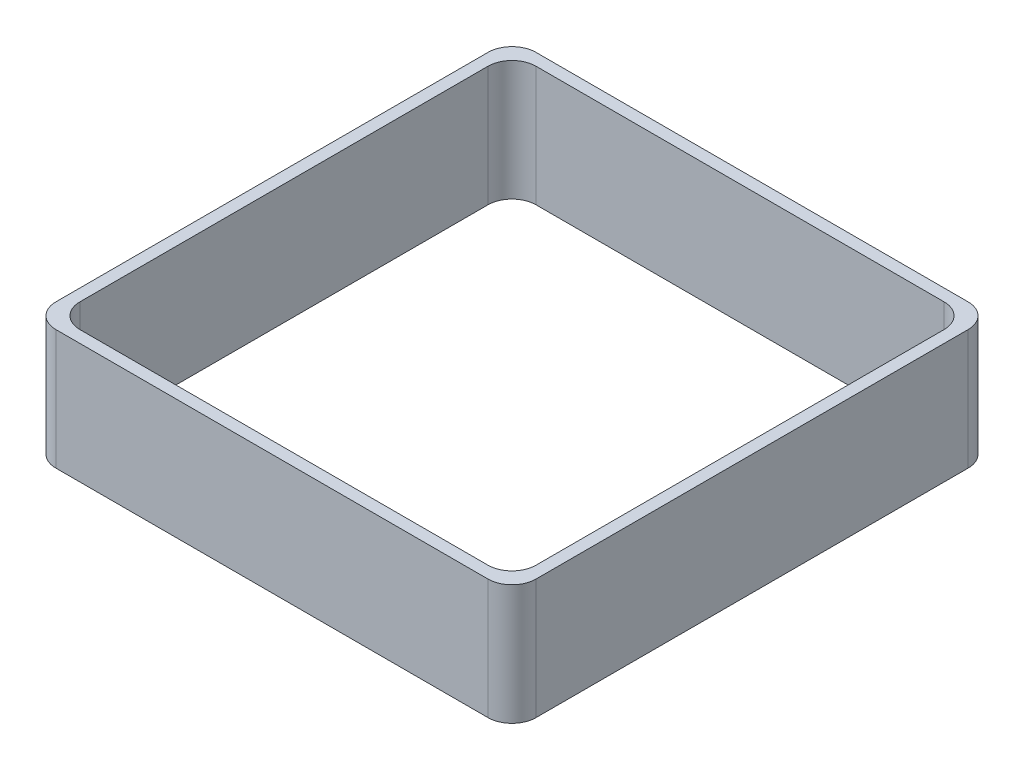
ISO-10303-21;
HEADER;
FILE_DESCRIPTION(('STEP AP214'),'2;1');
FILE_NAME('part.step','',(''),(''),'','','');
FILE_SCHEMA(('AUTOMOTIVE_DESIGN { 1 0 10303 214 1 1 1 1 }'));
ENDSEC;
DATA;
#1=APPLICATION_CONTEXT('core data for automotive mechanical design processes');
#2=APPLICATION_PROTOCOL_DEFINITION('international standard','automotive_design',2000,#1);
#3=PRODUCT_CONTEXT('',#1,'mechanical');
#4=PRODUCT('Part','Part','',(#3));
#5=PRODUCT_RELATED_PRODUCT_CATEGORY('part','',(#4));
#6=PRODUCT_DEFINITION_FORMATION('','',#4);
#7=PRODUCT_DEFINITION_CONTEXT('part definition',#1,'design');
#8=PRODUCT_DEFINITION('design','',#6,#7);
#9=PRODUCT_DEFINITION_SHAPE('','',#8);
#10=(LENGTH_UNIT() NAMED_UNIT(*) SI_UNIT(.MILLI.,.METRE.));
#11=(NAMED_UNIT(*) PLANE_ANGLE_UNIT() SI_UNIT($,.RADIAN.));
#12=(NAMED_UNIT(*) SI_UNIT($,.STERADIAN.) SOLID_ANGLE_UNIT());
#13=UNCERTAINTY_MEASURE_WITH_UNIT(LENGTH_MEASURE(1.E-05),#10,'distance_accuracy_value','');
#14=(GEOMETRIC_REPRESENTATION_CONTEXT(3) GLOBAL_UNCERTAINTY_ASSIGNED_CONTEXT((#13)) GLOBAL_UNIT_ASSIGNED_CONTEXT((#10,
#11,#12)) REPRESENTATION_CONTEXT('',''));
#15=CARTESIAN_POINT('',(0.,0.,0.));
#16=DIRECTION('',(0.,0.,1.));
#17=DIRECTION('',(1.,0.,0.));
#18=AXIS2_PLACEMENT_3D('',#15,#16,#17);
#19=CARTESIAN_POINT('',(0.,50.,0.));
#20=DIRECTION('',(0.,-1.,0.));
#21=DIRECTION('',(0.,0.,-1.));
#22=AXIS2_PLACEMENT_3D('',#19,#20,#21);
#23=PLANE('',#22);
#24=DIRECTION('',(-1.,0.,0.));
#25=VECTOR('',#24,1.);
#26=CARTESIAN_POINT('',(100.,50.,-100.));
#27=LINE('',#26,#25);
#28=CARTESIAN_POINT('',(90.,50.,-100.));
#29=VERTEX_POINT('',#28);
#30=CARTESIAN_POINT('',(-90.,50.,-100.));
#31=VERTEX_POINT('',#30);
#32=EDGE_CURVE('E183',#29,#31,#27,.T.);
#33=ORIENTED_EDGE('',*,*,#32,.T.);
#34=CARTESIAN_POINT('',(-90.,50.,-90.));
#35=DIRECTION('',(0.,-1.,0.));
#36=DIRECTION('',(0.,0.,-1.));
#37=AXIS2_PLACEMENT_3D('',#34,#35,#36);
#38=CIRCLE('',#37,10.);
#39=CARTESIAN_POINT('',(-100.,50.,-90.));
#40=VERTEX_POINT('',#39);
#41=EDGE_CURVE('E204',#31,#40,#38,.F.);
#42=ORIENTED_EDGE('',*,*,#41,.T.);
#43=DIRECTION('',(0.,0.,1.));
#44=VECTOR('',#43,1.);
#45=CARTESIAN_POINT('',(-100.,50.,-100.));
#46=LINE('',#45,#44);
#47=CARTESIAN_POINT('',(-100.,50.,90.));
#48=VERTEX_POINT('',#47);
#49=EDGE_CURVE('E166',#40,#48,#46,.T.);
#50=ORIENTED_EDGE('',*,*,#49,.T.);
#51=CARTESIAN_POINT('',(-90.,50.,90.));
#52=DIRECTION('',(0.,-1.,0.));
#53=DIRECTION('',(0.,0.,-1.));
#54=AXIS2_PLACEMENT_3D('',#51,#52,#53);
#55=CIRCLE('',#54,10.);
#56=CARTESIAN_POINT('',(-90.,50.,100.));
#57=VERTEX_POINT('',#56);
#58=EDGE_CURVE('E202',#48,#57,#55,.F.);
#59=ORIENTED_EDGE('',*,*,#58,.T.);
#60=DIRECTION('',(1.,0.,0.));
#61=VECTOR('',#60,1.);
#62=CARTESIAN_POINT('',(100.,50.,100.));
#63=LINE('',#62,#61);
#64=CARTESIAN_POINT('',(90.,50.,100.));
#65=VERTEX_POINT('',#64);
#66=EDGE_CURVE('E276',#57,#65,#63,.T.);
#67=ORIENTED_EDGE('',*,*,#66,.T.);
#68=CARTESIAN_POINT('',(90.,50.,90.));
#69=DIRECTION('',(0.,-1.,0.));
#70=DIRECTION('',(0.,0.,-1.));
#71=AXIS2_PLACEMENT_3D('',#68,#69,#70);
#72=CIRCLE('',#71,10.);
#73=CARTESIAN_POINT('',(100.,50.,90.));
#74=VERTEX_POINT('',#73);
#75=EDGE_CURVE('E200',#65,#74,#72,.F.);
#76=ORIENTED_EDGE('',*,*,#75,.T.);
#77=DIRECTION('',(0.,0.,-1.));
#78=VECTOR('',#77,1.);
#79=CARTESIAN_POINT('',(100.,50.,-100.));
#80=LINE('',#79,#78);
#81=CARTESIAN_POINT('',(100.,50.,-90.));
#82=VERTEX_POINT('',#81);
#83=EDGE_CURVE('E278',#74,#82,#80,.T.);
#84=ORIENTED_EDGE('',*,*,#83,.T.);
#85=CARTESIAN_POINT('',(90.,50.,-90.));
#86=DIRECTION('',(0.,-1.,0.));
#87=DIRECTION('',(0.,0.,-1.));
#88=AXIS2_PLACEMENT_3D('',#85,#86,#87);
#89=CIRCLE('',#88,10.);
#90=EDGE_CURVE('E198',#82,#29,#89,.F.);
#91=ORIENTED_EDGE('',*,*,#90,.T.);
#92=EDGE_LOOP('',(#33,#42,#50,#59,#67,#76,#84,#91));
#93=FACE_BOUND('',#92,.T.);
#94=DIRECTION('',(0.,0.,-1.));
#95=VECTOR('',#94,1.);
#96=CARTESIAN_POINT('',(95.,50.,-95.));
#97=LINE('',#96,#95);
#98=CARTESIAN_POINT('',(95.,50.,85.));
#99=VERTEX_POINT('',#98);
#100=CARTESIAN_POINT('',(95.,50.,-85.));
#101=VERTEX_POINT('',#100);
#102=EDGE_CURVE('E263',#99,#101,#97,.T.);
#103=ORIENTED_EDGE('',*,*,#102,.F.);
#104=CARTESIAN_POINT('',(85.,50.,85.));
#105=DIRECTION('',(0.,-1.,0.));
#106=DIRECTION('',(0.,0.,-1.));
#107=AXIS2_PLACEMENT_3D('',#104,#105,#106);
#108=CIRCLE('',#107,10.);
#109=CARTESIAN_POINT('',(85.,50.,95.));
#110=VERTEX_POINT('',#109);
#111=EDGE_CURVE('E241',#99,#110,#108,.T.);
#112=ORIENTED_EDGE('',*,*,#111,.T.);
#113=DIRECTION('',(1.,0.,0.));
#114=VECTOR('',#113,1.);
#115=CARTESIAN_POINT('',(95.,50.,95.));
#116=LINE('',#115,#114);
#117=CARTESIAN_POINT('',(-85.,50.,95.));
#118=VERTEX_POINT('',#117);
#119=EDGE_CURVE('E174',#118,#110,#116,.T.);
#120=ORIENTED_EDGE('',*,*,#119,.F.);
#121=CARTESIAN_POINT('',(-85.,50.,85.));
#122=DIRECTION('',(0.,-1.,0.));
#123=DIRECTION('',(0.,0.,-1.));
#124=AXIS2_PLACEMENT_3D('',#121,#122,#123);
#125=CIRCLE('',#124,10.);
#126=CARTESIAN_POINT('',(-95.,50.,85.));
#127=VERTEX_POINT('',#126);
#128=EDGE_CURVE('E245',#118,#127,#125,.T.);
#129=ORIENTED_EDGE('',*,*,#128,.T.);
#130=DIRECTION('',(0.,0.,1.));
#131=VECTOR('',#130,1.);
#132=CARTESIAN_POINT('',(-95.,50.,-95.));
#133=LINE('',#132,#131);
#134=CARTESIAN_POINT('',(-95.,50.,-85.));
#135=VERTEX_POINT('',#134);
#136=EDGE_CURVE('E180',#135,#127,#133,.T.);
#137=ORIENTED_EDGE('',*,*,#136,.F.);
#138=CARTESIAN_POINT('',(-85.,50.,-85.));
#139=DIRECTION('',(0.,-1.,0.));
#140=DIRECTION('',(0.,0.,-1.));
#141=AXIS2_PLACEMENT_3D('',#138,#139,#140);
#142=CIRCLE('',#141,10.);
#143=CARTESIAN_POINT('',(-85.,50.,-95.));
#144=VERTEX_POINT('',#143);
#145=EDGE_CURVE('E11',#135,#144,#142,.T.);
#146=ORIENTED_EDGE('',*,*,#145,.T.);
#147=DIRECTION('',(-1.,0.,0.));
#148=VECTOR('',#147,1.);
#149=CARTESIAN_POINT('',(95.,50.,-95.));
#150=LINE('',#149,#148);
#151=CARTESIAN_POINT('',(85.,50.,-95.));
#152=VERTEX_POINT('',#151);
#153=EDGE_CURVE('E261',#152,#144,#150,.T.);
#154=ORIENTED_EDGE('',*,*,#153,.F.);
#155=CARTESIAN_POINT('',(85.,50.,-85.));
#156=DIRECTION('',(0.,-1.,0.));
#157=DIRECTION('',(0.,0.,-1.));
#158=AXIS2_PLACEMENT_3D('',#155,#156,#157);
#159=CIRCLE('',#158,10.);
#160=EDGE_CURVE('E237',#152,#101,#159,.T.);
#161=ORIENTED_EDGE('',*,*,#160,.T.);
#162=EDGE_LOOP('',(#103,#112,#120,#129,#137,#146,#154,#161));
#163=FACE_BOUND('',#162,.T.);
#164=ADVANCED_FACE('F33',(#93,#163),#23,.F.);
#165=CARTESIAN_POINT('',(0.,0.,0.));
#166=DIRECTION('',(0.,-1.,0.));
#167=DIRECTION('',(0.,0.,-1.));
#168=AXIS2_PLACEMENT_3D('',#165,#166,#167);
#169=PLANE('',#168);
#170=DIRECTION('',(0.,0.,1.));
#171=VECTOR('',#170,1.);
#172=CARTESIAN_POINT('',(-100.,0.,-100.));
#173=LINE('',#172,#171);
#174=CARTESIAN_POINT('',(-100.,0.,-90.));
#175=VERTEX_POINT('',#174);
#176=CARTESIAN_POINT('',(-100.,0.,90.));
#177=VERTEX_POINT('',#176);
#178=EDGE_CURVE('E163',#175,#177,#173,.T.);
#179=ORIENTED_EDGE('',*,*,#178,.F.);
#180=CARTESIAN_POINT('',(-90.,0.,-90.));
#181=DIRECTION('',(0.,-1.,0.));
#182=DIRECTION('',(0.,0.,-1.));
#183=AXIS2_PLACEMENT_3D('',#180,#181,#182);
#184=CIRCLE('',#183,10.);
#185=CARTESIAN_POINT('',(-90.,0.,-100.));
#186=VERTEX_POINT('',#185);
#187=EDGE_CURVE('E146',#175,#186,#184,.T.);
#188=ORIENTED_EDGE('',*,*,#187,.T.);
#189=DIRECTION('',(-1.,0.,0.));
#190=VECTOR('',#189,1.);
#191=CARTESIAN_POINT('',(100.,0.,-100.));
#192=LINE('',#191,#190);
#193=CARTESIAN_POINT('',(90.,0.,-100.));
#194=VERTEX_POINT('',#193);
#195=EDGE_CURVE('E188',#194,#186,#192,.T.);
#196=ORIENTED_EDGE('',*,*,#195,.F.);
#197=CARTESIAN_POINT('',(90.,0.,-90.));
#198=DIRECTION('',(0.,-1.,0.));
#199=DIRECTION('',(0.,0.,-1.));
#200=AXIS2_PLACEMENT_3D('',#197,#198,#199);
#201=CIRCLE('',#200,10.);
#202=CARTESIAN_POINT('',(100.,0.,-90.));
#203=VERTEX_POINT('',#202);
#204=EDGE_CURVE('E167',#194,#203,#201,.T.);
#205=ORIENTED_EDGE('',*,*,#204,.T.);
#206=DIRECTION('',(0.,0.,-1.));
#207=VECTOR('',#206,1.);
#208=CARTESIAN_POINT('',(100.,0.,-100.));
#209=LINE('',#208,#207);
#210=CARTESIAN_POINT('',(100.,0.,90.));
#211=VERTEX_POINT('',#210);
#212=EDGE_CURVE('E177',#211,#203,#209,.T.);
#213=ORIENTED_EDGE('',*,*,#212,.F.);
#214=CARTESIAN_POINT('',(90.,0.,90.));
#215=DIRECTION('',(0.,-1.,0.));
#216=DIRECTION('',(0.,0.,-1.));
#217=AXIS2_PLACEMENT_3D('',#214,#215,#216);
#218=CIRCLE('',#217,10.);
#219=CARTESIAN_POINT('',(90.,0.,100.));
#220=VERTEX_POINT('',#219);
#221=EDGE_CURVE('E192',#211,#220,#218,.T.);
#222=ORIENTED_EDGE('',*,*,#221,.T.);
#223=DIRECTION('',(1.,0.,0.));
#224=VECTOR('',#223,1.);
#225=CARTESIAN_POINT('',(100.,0.,100.));
#226=LINE('',#225,#224);
#227=CARTESIAN_POINT('',(-90.,0.,100.));
#228=VERTEX_POINT('',#227);
#229=EDGE_CURVE('E173',#228,#220,#226,.T.);
#230=ORIENTED_EDGE('',*,*,#229,.F.);
#231=CARTESIAN_POINT('',(-90.,0.,90.));
#232=DIRECTION('',(0.,-1.,0.));
#233=DIRECTION('',(0.,0.,-1.));
#234=AXIS2_PLACEMENT_3D('',#231,#232,#233);
#235=CIRCLE('',#234,10.);
#236=EDGE_CURVE('E157',#228,#177,#235,.T.);
#237=ORIENTED_EDGE('',*,*,#236,.T.);
#238=EDGE_LOOP('',(#179,#188,#196,#205,#213,#222,#230,#237));
#239=FACE_BOUND('',#238,.T.);
#240=DIRECTION('',(0.,0.,1.));
#241=VECTOR('',#240,1.);
#242=CARTESIAN_POINT('',(-95.,0.,-95.));
#243=LINE('',#242,#241);
#244=CARTESIAN_POINT('',(-95.,0.,-85.));
#245=VERTEX_POINT('',#244);
#246=CARTESIAN_POINT('',(-95.,0.,85.));
#247=VERTEX_POINT('',#246);
#248=EDGE_CURVE('E249',#245,#247,#243,.T.);
#249=ORIENTED_EDGE('',*,*,#248,.T.);
#250=CARTESIAN_POINT('',(-85.,0.,85.));
#251=DIRECTION('',(0.,-1.,0.));
#252=DIRECTION('',(0.,0.,-1.));
#253=AXIS2_PLACEMENT_3D('',#250,#251,#252);
#254=CIRCLE('',#253,10.);
#255=CARTESIAN_POINT('',(-85.,0.,95.));
#256=VERTEX_POINT('',#255);
#257=EDGE_CURVE('E243',#247,#256,#254,.F.);
#258=ORIENTED_EDGE('',*,*,#257,.T.);
#259=DIRECTION('',(1.,0.,0.));
#260=VECTOR('',#259,1.);
#261=CARTESIAN_POINT('',(95.,0.,95.));
#262=LINE('',#261,#260);
#263=CARTESIAN_POINT('',(85.,0.,95.));
#264=VERTEX_POINT('',#263);
#265=EDGE_CURVE('E258',#256,#264,#262,.T.);
#266=ORIENTED_EDGE('',*,*,#265,.T.);
#267=CARTESIAN_POINT('',(85.,0.,85.));
#268=DIRECTION('',(0.,-1.,0.));
#269=DIRECTION('',(0.,0.,-1.));
#270=AXIS2_PLACEMENT_3D('',#267,#268,#269);
#271=CIRCLE('',#270,10.);
#272=CARTESIAN_POINT('',(95.,0.,85.));
#273=VERTEX_POINT('',#272);
#274=EDGE_CURVE('E239',#264,#273,#271,.F.);
#275=ORIENTED_EDGE('',*,*,#274,.T.);
#276=DIRECTION('',(0.,0.,-1.));
#277=VECTOR('',#276,1.);
#278=CARTESIAN_POINT('',(95.,0.,-95.));
#279=LINE('',#278,#277);
#280=CARTESIAN_POINT('',(95.,0.,-85.));
#281=VERTEX_POINT('',#280);
#282=EDGE_CURVE('E269',#273,#281,#279,.T.);
#283=ORIENTED_EDGE('',*,*,#282,.T.);
#284=CARTESIAN_POINT('',(85.,0.,-85.));
#285=DIRECTION('',(0.,-1.,0.));
#286=DIRECTION('',(0.,0.,-1.));
#287=AXIS2_PLACEMENT_3D('',#284,#285,#286);
#288=CIRCLE('',#287,10.);
#289=CARTESIAN_POINT('',(85.,0.,-95.));
#290=VERTEX_POINT('',#289);
#291=EDGE_CURVE('E235',#281,#290,#288,.F.);
#292=ORIENTED_EDGE('',*,*,#291,.T.);
#293=DIRECTION('',(-1.,0.,0.));
#294=VECTOR('',#293,1.);
#295=CARTESIAN_POINT('',(95.,0.,-95.));
#296=LINE('',#295,#294);
#297=CARTESIAN_POINT('',(-85.,0.,-95.));
#298=VERTEX_POINT('',#297);
#299=EDGE_CURVE('E250',#290,#298,#296,.T.);
#300=ORIENTED_EDGE('',*,*,#299,.T.);
#301=CARTESIAN_POINT('',(-85.,0.,-85.));
#302=DIRECTION('',(0.,-1.,0.));
#303=DIRECTION('',(0.,0.,-1.));
#304=AXIS2_PLACEMENT_3D('',#301,#302,#303);
#305=CIRCLE('',#304,10.);
#306=EDGE_CURVE('E41',#298,#245,#305,.F.);
#307=ORIENTED_EDGE('',*,*,#306,.T.);
#308=EDGE_LOOP('',(#249,#258,#266,#275,#283,#292,#300,#307));
#309=FACE_BOUND('',#308,.T.);
#310=ADVANCED_FACE('F170',(#239,#309),#169,.T.);
#311=CARTESIAN_POINT('',(-100.,50.,-100.));
#312=DIRECTION('',(1.,0.,0.));
#313=DIRECTION('',(0.,0.,-1.));
#314=AXIS2_PLACEMENT_3D('',#311,#312,#313);
#315=PLANE('',#314);
#316=ORIENTED_EDGE('',*,*,#49,.F.);
#317=DIRECTION('',(0.,-1.,0.));
#318=VECTOR('',#317,1.);
#319=CARTESIAN_POINT('',(-100.,50.,-90.));
#320=LINE('',#319,#318);
#321=EDGE_CURVE('E150',#40,#175,#320,.T.);
#322=ORIENTED_EDGE('',*,*,#321,.T.);
#323=ORIENTED_EDGE('',*,*,#178,.T.);
#324=DIRECTION('',(0.,-1.,0.));
#325=VECTOR('',#324,1.);
#326=CARTESIAN_POINT('',(-100.,50.,90.));
#327=LINE('',#326,#325);
#328=EDGE_CURVE('E168',#177,#48,#327,.F.);
#329=ORIENTED_EDGE('',*,*,#328,.T.);
#330=EDGE_LOOP('',(#316,#322,#323,#329));
#331=FACE_BOUND('',#330,.T.);
#332=ADVANCED_FACE('F162',(#331),#315,.F.);
#333=CARTESIAN_POINT('',(100.,50.,100.));
#334=DIRECTION('',(0.,0.,-1.));
#335=DIRECTION('',(-1.,0.,0.));
#336=AXIS2_PLACEMENT_3D('',#333,#334,#335);
#337=PLANE('',#336);
#338=ORIENTED_EDGE('',*,*,#66,.F.);
#339=DIRECTION('',(0.,-1.,0.));
#340=VECTOR('',#339,1.);
#341=CARTESIAN_POINT('',(-90.,50.,100.));
#342=LINE('',#341,#340);
#343=EDGE_CURVE('E208',#57,#228,#342,.T.);
#344=ORIENTED_EDGE('',*,*,#343,.T.);
#345=ORIENTED_EDGE('',*,*,#229,.T.);
#346=DIRECTION('',(0.,-1.,0.));
#347=VECTOR('',#346,1.);
#348=CARTESIAN_POINT('',(90.,50.,100.));
#349=LINE('',#348,#347);
#350=EDGE_CURVE('E206',#220,#65,#349,.F.);
#351=ORIENTED_EDGE('',*,*,#350,.T.);
#352=EDGE_LOOP('',(#338,#344,#345,#351));
#353=FACE_BOUND('',#352,.T.);
#354=ADVANCED_FACE('F301',(#353),#337,.F.);
#355=CARTESIAN_POINT('',(100.,50.,-100.));
#356=DIRECTION('',(-1.,0.,0.));
#357=DIRECTION('',(0.,0.,1.));
#358=AXIS2_PLACEMENT_3D('',#355,#356,#357);
#359=PLANE('',#358);
#360=ORIENTED_EDGE('',*,*,#83,.F.);
#361=DIRECTION('',(0.,-1.,0.));
#362=VECTOR('',#361,1.);
#363=CARTESIAN_POINT('',(100.,50.,90.));
#364=LINE('',#363,#362);
#365=EDGE_CURVE('E213',#74,#211,#364,.T.);
#366=ORIENTED_EDGE('',*,*,#365,.T.);
#367=ORIENTED_EDGE('',*,*,#212,.T.);
#368=DIRECTION('',(0.,-1.,0.));
#369=VECTOR('',#368,1.);
#370=CARTESIAN_POINT('',(100.,50.,-90.));
#371=LINE('',#370,#369);
#372=EDGE_CURVE('E211',#203,#82,#371,.F.);
#373=ORIENTED_EDGE('',*,*,#372,.T.);
#374=EDGE_LOOP('',(#360,#366,#367,#373));
#375=FACE_BOUND('',#374,.T.);
#376=ADVANCED_FACE('F293',(#375),#359,.F.);
#377=CARTESIAN_POINT('',(100.,50.,-100.));
#378=DIRECTION('',(0.,0.,1.));
#379=DIRECTION('',(1.,0.,0.));
#380=AXIS2_PLACEMENT_3D('',#377,#378,#379);
#381=PLANE('',#380);
#382=ORIENTED_EDGE('',*,*,#195,.T.);
#383=DIRECTION('',(0.,-1.,0.));
#384=VECTOR('',#383,1.);
#385=CARTESIAN_POINT('',(-90.,50.,-100.));
#386=LINE('',#385,#384);
#387=EDGE_CURVE('E151',#186,#31,#386,.F.);
#388=ORIENTED_EDGE('',*,*,#387,.T.);
#389=ORIENTED_EDGE('',*,*,#32,.F.);
#390=DIRECTION('',(0.,-1.,0.));
#391=VECTOR('',#390,1.);
#392=CARTESIAN_POINT('',(90.,50.,-100.));
#393=LINE('',#392,#391);
#394=EDGE_CURVE('E156',#29,#194,#393,.T.);
#395=ORIENTED_EDGE('',*,*,#394,.T.);
#396=EDGE_LOOP('',(#382,#388,#389,#395));
#397=FACE_BOUND('',#396,.T.);
#398=ADVANCED_FACE('F287',(#397),#381,.F.);
#399=CARTESIAN_POINT('',(95.,50.,-95.));
#400=DIRECTION('',(-1.,0.,0.));
#401=DIRECTION('',(0.,0.,1.));
#402=AXIS2_PLACEMENT_3D('',#399,#400,#401);
#403=PLANE('',#402);
#404=ORIENTED_EDGE('',*,*,#102,.T.);
#405=DIRECTION('',(0.,-1.,0.));
#406=VECTOR('',#405,1.);
#407=CARTESIAN_POINT('',(95.,0.,-85.));
#408=LINE('',#407,#406);
#409=EDGE_CURVE('E218',#101,#281,#408,.T.);
#410=ORIENTED_EDGE('',*,*,#409,.T.);
#411=ORIENTED_EDGE('',*,*,#282,.F.);
#412=DIRECTION('',(0.,-1.,0.));
#413=VECTOR('',#412,1.);
#414=CARTESIAN_POINT('',(95.,50.,85.));
#415=LINE('',#414,#413);
#416=EDGE_CURVE('E216',#273,#99,#415,.F.);
#417=ORIENTED_EDGE('',*,*,#416,.T.);
#418=EDGE_LOOP('',(#404,#410,#411,#417));
#419=FACE_BOUND('',#418,.T.);
#420=ADVANCED_FACE('F322',(#419),#403,.T.);
#421=CARTESIAN_POINT('',(95.,50.,-95.));
#422=DIRECTION('',(0.,0.,1.));
#423=DIRECTION('',(1.,0.,0.));
#424=AXIS2_PLACEMENT_3D('',#421,#422,#423);
#425=PLANE('',#424);
#426=ORIENTED_EDGE('',*,*,#299,.F.);
#427=DIRECTION('',(0.,-1.,0.));
#428=VECTOR('',#427,1.);
#429=CARTESIAN_POINT('',(85.,50.,-95.));
#430=LINE('',#429,#428);
#431=EDGE_CURVE('E53',#290,#152,#430,.F.);
#432=ORIENTED_EDGE('',*,*,#431,.T.);
#433=ORIENTED_EDGE('',*,*,#153,.T.);
#434=DIRECTION('',(0.,-1.,0.));
#435=VECTOR('',#434,1.);
#436=CARTESIAN_POINT('',(-85.,0.,-95.));
#437=LINE('',#436,#435);
#438=EDGE_CURVE('E221',#144,#298,#437,.T.);
#439=ORIENTED_EDGE('',*,*,#438,.T.);
#440=EDGE_LOOP('',(#426,#432,#433,#439));
#441=FACE_BOUND('',#440,.T.);
#442=ADVANCED_FACE('F260',(#441),#425,.T.);
#443=CARTESIAN_POINT('',(-95.,50.,-95.));
#444=DIRECTION('',(1.,0.,0.));
#445=DIRECTION('',(0.,0.,-1.));
#446=AXIS2_PLACEMENT_3D('',#443,#444,#445);
#447=PLANE('',#446);
#448=ORIENTED_EDGE('',*,*,#136,.T.);
#449=DIRECTION('',(0.,-1.,0.));
#450=VECTOR('',#449,1.);
#451=CARTESIAN_POINT('',(-95.,0.,85.));
#452=LINE('',#451,#450);
#453=EDGE_CURVE('E232',#127,#247,#452,.T.);
#454=ORIENTED_EDGE('',*,*,#453,.T.);
#455=ORIENTED_EDGE('',*,*,#248,.F.);
#456=DIRECTION('',(0.,-1.,0.));
#457=VECTOR('',#456,1.);
#458=CARTESIAN_POINT('',(-95.,50.,-85.));
#459=LINE('',#458,#457);
#460=EDGE_CURVE('E230',#245,#135,#459,.F.);
#461=ORIENTED_EDGE('',*,*,#460,.T.);
#462=EDGE_LOOP('',(#448,#454,#455,#461));
#463=FACE_BOUND('',#462,.T.);
#464=ADVANCED_FACE('F256',(#463),#447,.T.);
#465=CARTESIAN_POINT('',(95.,50.,95.));
#466=DIRECTION('',(0.,0.,-1.));
#467=DIRECTION('',(-1.,0.,0.));
#468=AXIS2_PLACEMENT_3D('',#465,#466,#467);
#469=PLANE('',#468);
#470=ORIENTED_EDGE('',*,*,#119,.T.);
#471=DIRECTION('',(0.,-1.,0.));
#472=VECTOR('',#471,1.);
#473=CARTESIAN_POINT('',(85.,0.,95.));
#474=LINE('',#473,#472);
#475=EDGE_CURVE('E227',#110,#264,#474,.T.);
#476=ORIENTED_EDGE('',*,*,#475,.T.);
#477=ORIENTED_EDGE('',*,*,#265,.F.);
#478=DIRECTION('',(0.,-1.,0.));
#479=VECTOR('',#478,1.);
#480=CARTESIAN_POINT('',(-85.,50.,95.));
#481=LINE('',#480,#479);
#482=EDGE_CURVE('E225',#256,#118,#481,.F.);
#483=ORIENTED_EDGE('',*,*,#482,.T.);
#484=EDGE_LOOP('',(#470,#476,#477,#483));
#485=FACE_BOUND('',#484,.T.);
#486=ADVANCED_FACE('F313',(#485),#469,.T.);
#487=CARTESIAN_POINT('',(-90.,50.,-90.));
#488=DIRECTION('',(0.,-1.,0.));
#489=DIRECTION('',(0.,0.,-1.));
#490=AXIS2_PLACEMENT_3D('',#487,#488,#489);
#491=CYLINDRICAL_SURFACE('',#490,10.);
#492=ORIENTED_EDGE('',*,*,#41,.F.);
#493=ORIENTED_EDGE('',*,*,#387,.F.);
#494=ORIENTED_EDGE('',*,*,#187,.F.);
#495=ORIENTED_EDGE('',*,*,#321,.F.);
#496=EDGE_LOOP('',(#492,#493,#494,#495));
#497=FACE_BOUND('',#496,.T.);
#498=ADVANCED_FACE('F149',(#497),#491,.T.);
#499=CARTESIAN_POINT('',(-90.,50.,90.));
#500=DIRECTION('',(0.,-1.,0.));
#501=DIRECTION('',(0.,0.,-1.));
#502=AXIS2_PLACEMENT_3D('',#499,#500,#501);
#503=CYLINDRICAL_SURFACE('',#502,10.);
#504=ORIENTED_EDGE('',*,*,#58,.F.);
#505=ORIENTED_EDGE('',*,*,#328,.F.);
#506=ORIENTED_EDGE('',*,*,#236,.F.);
#507=ORIENTED_EDGE('',*,*,#343,.F.);
#508=EDGE_LOOP('',(#504,#505,#506,#507));
#509=FACE_BOUND('',#508,.T.);
#510=ADVANCED_FACE('F305',(#509),#503,.T.);
#511=CARTESIAN_POINT('',(90.,50.,90.));
#512=DIRECTION('',(0.,-1.,0.));
#513=DIRECTION('',(0.,0.,-1.));
#514=AXIS2_PLACEMENT_3D('',#511,#512,#513);
#515=CYLINDRICAL_SURFACE('',#514,10.);
#516=ORIENTED_EDGE('',*,*,#75,.F.);
#517=ORIENTED_EDGE('',*,*,#350,.F.);
#518=ORIENTED_EDGE('',*,*,#221,.F.);
#519=ORIENTED_EDGE('',*,*,#365,.F.);
#520=EDGE_LOOP('',(#516,#517,#518,#519));
#521=FACE_BOUND('',#520,.T.);
#522=ADVANCED_FACE('F297',(#521),#515,.T.);
#523=CARTESIAN_POINT('',(90.,50.,-90.));
#524=DIRECTION('',(0.,-1.,0.));
#525=DIRECTION('',(0.,0.,-1.));
#526=AXIS2_PLACEMENT_3D('',#523,#524,#525);
#527=CYLINDRICAL_SURFACE('',#526,10.);
#528=ORIENTED_EDGE('',*,*,#90,.F.);
#529=ORIENTED_EDGE('',*,*,#372,.F.);
#530=ORIENTED_EDGE('',*,*,#204,.F.);
#531=ORIENTED_EDGE('',*,*,#394,.F.);
#532=EDGE_LOOP('',(#528,#529,#530,#531));
#533=FACE_BOUND('',#532,.T.);
#534=ADVANCED_FACE('F289',(#533),#527,.T.);
#535=CARTESIAN_POINT('',(85.,50.,-85.));
#536=DIRECTION('',(0.,1.,0.));
#537=DIRECTION('',(0.,0.,1.));
#538=AXIS2_PLACEMENT_3D('',#535,#536,#537);
#539=CYLINDRICAL_SURFACE('',#538,10.);
#540=ORIENTED_EDGE('',*,*,#160,.F.);
#541=ORIENTED_EDGE('',*,*,#431,.F.);
#542=ORIENTED_EDGE('',*,*,#291,.F.);
#543=ORIENTED_EDGE('',*,*,#409,.F.);
#544=EDGE_LOOP('',(#540,#541,#542,#543));
#545=FACE_BOUND('',#544,.T.);
#546=ADVANCED_FACE('F395',(#545),#539,.F.);
#547=CARTESIAN_POINT('',(85.,50.,85.));
#548=DIRECTION('',(0.,1.,0.));
#549=DIRECTION('',(0.,0.,1.));
#550=AXIS2_PLACEMENT_3D('',#547,#548,#549);
#551=CYLINDRICAL_SURFACE('',#550,10.);
#552=ORIENTED_EDGE('',*,*,#111,.F.);
#553=ORIENTED_EDGE('',*,*,#416,.F.);
#554=ORIENTED_EDGE('',*,*,#274,.F.);
#555=ORIENTED_EDGE('',*,*,#475,.F.);
#556=EDGE_LOOP('',(#552,#553,#554,#555));
#557=FACE_BOUND('',#556,.T.);
#558=ADVANCED_FACE('F404',(#557),#551,.F.);
#559=CARTESIAN_POINT('',(-85.,50.,85.));
#560=DIRECTION('',(0.,1.,0.));
#561=DIRECTION('',(0.,0.,1.));
#562=AXIS2_PLACEMENT_3D('',#559,#560,#561);
#563=CYLINDRICAL_SURFACE('',#562,10.);
#564=ORIENTED_EDGE('',*,*,#128,.F.);
#565=ORIENTED_EDGE('',*,*,#482,.F.);
#566=ORIENTED_EDGE('',*,*,#257,.F.);
#567=ORIENTED_EDGE('',*,*,#453,.F.);
#568=EDGE_LOOP('',(#564,#565,#566,#567));
#569=FACE_BOUND('',#568,.T.);
#570=ADVANCED_FACE('F414',(#569),#563,.F.);
#571=CARTESIAN_POINT('',(-85.,50.,-85.));
#572=DIRECTION('',(0.,1.,0.));
#573=DIRECTION('',(0.,0.,1.));
#574=AXIS2_PLACEMENT_3D('',#571,#572,#573);
#575=CYLINDRICAL_SURFACE('',#574,10.);
#576=ORIENTED_EDGE('',*,*,#145,.F.);
#577=ORIENTED_EDGE('',*,*,#460,.F.);
#578=ORIENTED_EDGE('',*,*,#306,.F.);
#579=ORIENTED_EDGE('',*,*,#438,.F.);
#580=EDGE_LOOP('',(#576,#577,#578,#579));
#581=FACE_BOUND('',#580,.T.);
#582=ADVANCED_FACE('F35',(#581),#575,.F.);
#583=CLOSED_SHELL('',(#164,#310,#332,#354,#376,#398,#420,#442,#464,#486,#498,#510,#522,#534,
#546,#558,#570,#582));
#584=MANIFOLD_SOLID_BREP('B2',#583);
#585=ADVANCED_BREP_SHAPE_REPRESENTATION('',(#18,#584),#14);
#586=SHAPE_DEFINITION_REPRESENTATION(#9,#585);
ENDSEC;
END-ISO-10303-21;
